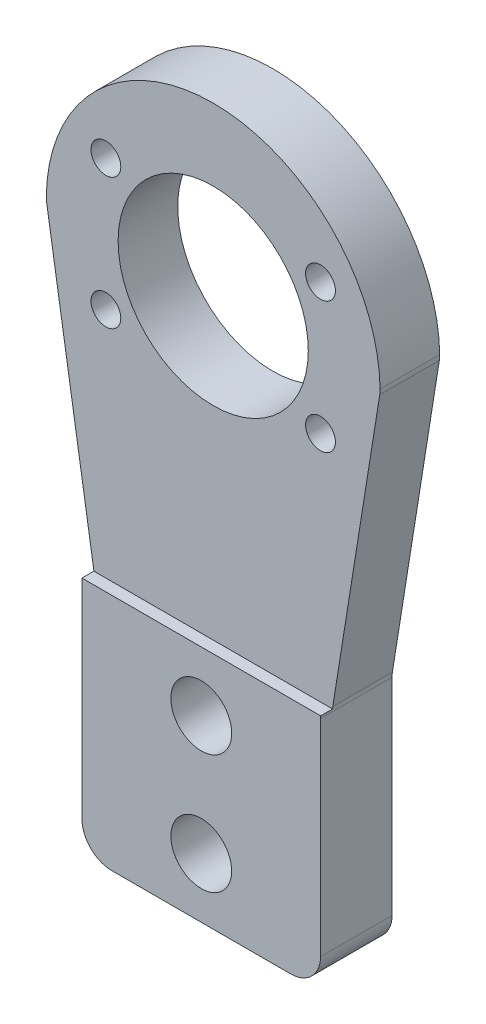
ISO-10303-21;
HEADER;
FILE_DESCRIPTION(('STEP AP214'),'2;1');
FILE_NAME('part.step','',(''),(''),'','','');
FILE_SCHEMA(('AUTOMOTIVE_DESIGN { 1 0 10303 214 1 1 1 1 }'));
ENDSEC;
DATA;
#1=APPLICATION_CONTEXT('core data for automotive mechanical design processes');
#2=APPLICATION_PROTOCOL_DEFINITION('international standard','automotive_design',2000,#1);
#3=PRODUCT_CONTEXT('',#1,'mechanical');
#4=PRODUCT('Part','Part','',(#3));
#5=PRODUCT_RELATED_PRODUCT_CATEGORY('part','',(#4));
#6=PRODUCT_DEFINITION_FORMATION('','',#4);
#7=PRODUCT_DEFINITION_CONTEXT('part definition',#1,'design');
#8=PRODUCT_DEFINITION('design','',#6,#7);
#9=PRODUCT_DEFINITION_SHAPE('','',#8);
#10=(LENGTH_UNIT() NAMED_UNIT(*) SI_UNIT(.MILLI.,.METRE.));
#11=(NAMED_UNIT(*) PLANE_ANGLE_UNIT() SI_UNIT($,.RADIAN.));
#12=(NAMED_UNIT(*) SI_UNIT($,.STERADIAN.) SOLID_ANGLE_UNIT());
#13=UNCERTAINTY_MEASURE_WITH_UNIT(LENGTH_MEASURE(1.E-05),#10,'distance_accuracy_value','');
#14=(GEOMETRIC_REPRESENTATION_CONTEXT(3) GLOBAL_UNCERTAINTY_ASSIGNED_CONTEXT((#13)) GLOBAL_UNIT_ASSIGNED_CONTEXT((#10,
#11,#12)) REPRESENTATION_CONTEXT('',''));
#15=CARTESIAN_POINT('',(0.,0.,0.));
#16=DIRECTION('',(0.,0.,1.));
#17=DIRECTION('',(1.,0.,0.));
#18=AXIS2_PLACEMENT_3D('',#15,#16,#17);
#19=CARTESIAN_POINT('',(0.,30.,6.));
#20=DIRECTION('',(0.,0.,1.));
#21=DIRECTION('',(1.,0.,0.));
#22=AXIS2_PLACEMENT_3D('',#19,#20,#21);
#23=PLANE('',#22);
#24=DIRECTION('',(1.,0.,0.));
#25=VECTOR('',#24,1.);
#26=CARTESIAN_POINT('',(-20.,5.,6.));
#27=LINE('',#26,#25);
#28=CARTESIAN_POINT('',(-10.0079117286826,5.,6.));
#29=VERTEX_POINT('',#28);
#30=CARTESIAN_POINT('',(10.0079117286826,5.,6.));
#31=VERTEX_POINT('',#30);
#32=EDGE_CURVE('E137',#29,#31,#27,.T.);
#33=ORIENTED_EDGE('',*,*,#32,.F.);
#34=CARTESIAN_POINT('',(-12.5,4.8012638735348,6.));
#35=DIRECTION('',(0.,0.,1.));
#36=DIRECTION('',(1.,0.,0.));
#37=AXIS2_PLACEMENT_3D('',#34,#35,#36);
#38=CIRCLE('',#37,2.5);
#39=CARTESIAN_POINT('',(-10.,4.8012638735348,6.));
#40=VERTEX_POINT('',#39);
#41=EDGE_CURVE('E41',#29,#40,#38,.F.);
#42=ORIENTED_EDGE('',*,*,#41,.T.);
#43=DIRECTION('',(0.,-1.,0.));
#44=VECTOR('',#43,1.);
#45=CARTESIAN_POINT('',(-10.,-15.,6.));
#46=LINE('',#45,#44);
#47=CARTESIAN_POINT('',(-10.,-12.5,6.));
#48=VERTEX_POINT('',#47);
#49=EDGE_CURVE('E222',#40,#48,#46,.T.);
#50=ORIENTED_EDGE('',*,*,#49,.T.);
#51=CARTESIAN_POINT('',(-7.5,-12.5,6.));
#52=DIRECTION('',(0.,0.,1.));
#53=DIRECTION('',(1.,0.,0.));
#54=AXIS2_PLACEMENT_3D('',#51,#52,#53);
#55=CIRCLE('',#54,2.5);
#56=CARTESIAN_POINT('',(-7.5,-15.,6.));
#57=VERTEX_POINT('',#56);
#58=EDGE_CURVE('E263',#48,#57,#55,.T.);
#59=ORIENTED_EDGE('',*,*,#58,.T.);
#60=DIRECTION('',(1.,0.,0.));
#61=VECTOR('',#60,1.);
#62=CARTESIAN_POINT('',(10.,-15.,6.));
#63=LINE('',#62,#61);
#64=CARTESIAN_POINT('',(7.5,-15.,6.));
#65=VERTEX_POINT('',#64);
#66=EDGE_CURVE('E224',#57,#65,#63,.T.);
#67=ORIENTED_EDGE('',*,*,#66,.T.);
#68=CARTESIAN_POINT('',(7.5,-12.5,6.));
#69=DIRECTION('',(0.,0.,1.));
#70=DIRECTION('',(1.,0.,0.));
#71=AXIS2_PLACEMENT_3D('',#68,#69,#70);
#72=CIRCLE('',#71,2.5);
#73=CARTESIAN_POINT('',(10.,-12.5,6.));
#74=VERTEX_POINT('',#73);
#75=EDGE_CURVE('E265',#65,#74,#72,.T.);
#76=ORIENTED_EDGE('',*,*,#75,.T.);
#77=DIRECTION('',(0.,1.,0.));
#78=VECTOR('',#77,1.);
#79=CARTESIAN_POINT('',(10.,-15.,6.));
#80=LINE('',#79,#78);
#81=CARTESIAN_POINT('',(10.,4.80126387353479,6.));
#82=VERTEX_POINT('',#81);
#83=EDGE_CURVE('E228',#74,#82,#80,.T.);
#84=ORIENTED_EDGE('',*,*,#83,.T.);
#85=CARTESIAN_POINT('',(12.5,4.8012638735348,6.));
#86=DIRECTION('',(0.,0.,1.));
#87=DIRECTION('',(1.,0.,0.));
#88=AXIS2_PLACEMENT_3D('',#85,#86,#87);
#89=CIRCLE('',#88,2.5);
#90=EDGE_CURVE('E149',#82,#31,#89,.F.);
#91=ORIENTED_EDGE('',*,*,#90,.T.);
#92=EDGE_LOOP('',(#33,#42,#50,#59,#67,#76,#84,#91));
#93=FACE_BOUND('',#92,.T.);
#94=CARTESIAN_POINT('',(0.,0.,6.));
#95=DIRECTION('',(0.,0.,1.));
#96=DIRECTION('',(1.,0.,0.));
#97=AXIS2_PLACEMENT_3D('',#94,#95,#96);
#98=CIRCLE('',#97,2.55);
#99=CARTESIAN_POINT('',(2.55,0.,6.));
#100=VERTEX_POINT('',#99);
#101=EDGE_CURVE('E216',#100,#100,#98,.T.);
#102=ORIENTED_EDGE('',*,*,#101,.F.);
#103=EDGE_LOOP('',(#102));
#104=FACE_BOUND('',#103,.T.);
#105=CARTESIAN_POINT('',(0.,-10.,6.));
#106=DIRECTION('',(0.,0.,1.));
#107=DIRECTION('',(1.,0.,0.));
#108=AXIS2_PLACEMENT_3D('',#105,#106,#107);
#109=CIRCLE('',#108,2.55);
#110=CARTESIAN_POINT('',(2.55,-10.,6.));
#111=VERTEX_POINT('',#110);
#112=EDGE_CURVE('E210',#111,#111,#109,.T.);
#113=ORIENTED_EDGE('',*,*,#112,.F.);
#114=EDGE_LOOP('',(#113));
#115=FACE_BOUND('',#114,.T.);
#116=ADVANCED_FACE('F33',(#93,#104,#115),#23,.T.);
#117=CARTESIAN_POINT('',(0.,30.,0.));
#118=DIRECTION('',(0.,0.,1.));
#119=DIRECTION('',(1.,0.,0.));
#120=AXIS2_PLACEMENT_3D('',#117,#118,#119);
#121=PLANE('',#120);
#122=CARTESIAN_POINT('',(9.,35.5,0.));
#123=DIRECTION('',(0.,0.,1.));
#124=DIRECTION('',(1.,0.,0.));
#125=AXIS2_PLACEMENT_3D('',#122,#123,#124);
#126=CIRCLE('',#125,1.25);
#127=CARTESIAN_POINT('',(10.25,35.5,0.));
#128=VERTEX_POINT('',#127);
#129=EDGE_CURVE('E194',#128,#128,#126,.T.);
#130=ORIENTED_EDGE('',*,*,#129,.T.);
#131=EDGE_LOOP('',(#130));
#132=FACE_BOUND('',#131,.T.);
#133=CARTESIAN_POINT('',(-9.,35.5,0.));
#134=DIRECTION('',(0.,0.,1.));
#135=DIRECTION('',(1.,0.,0.));
#136=AXIS2_PLACEMENT_3D('',#133,#134,#135);
#137=CIRCLE('',#136,1.25);
#138=CARTESIAN_POINT('',(-7.75,35.5,0.));
#139=VERTEX_POINT('',#138);
#140=EDGE_CURVE('E197',#139,#139,#137,.T.);
#141=ORIENTED_EDGE('',*,*,#140,.T.);
#142=EDGE_LOOP('',(#141));
#143=FACE_BOUND('',#142,.T.);
#144=CARTESIAN_POINT('',(9.,24.5,0.));
#145=DIRECTION('',(0.,0.,1.));
#146=DIRECTION('',(1.,0.,0.));
#147=AXIS2_PLACEMENT_3D('',#144,#145,#146);
#148=CIRCLE('',#147,1.25);
#149=CARTESIAN_POINT('',(10.25,24.5,0.));
#150=VERTEX_POINT('',#149);
#151=EDGE_CURVE('E200',#150,#150,#148,.T.);
#152=ORIENTED_EDGE('',*,*,#151,.T.);
#153=EDGE_LOOP('',(#152));
#154=FACE_BOUND('',#153,.T.);
#155=CARTESIAN_POINT('',(-9.,24.5,0.));
#156=DIRECTION('',(0.,0.,1.));
#157=DIRECTION('',(1.,0.,0.));
#158=AXIS2_PLACEMENT_3D('',#155,#156,#157);
#159=CIRCLE('',#158,1.25);
#160=CARTESIAN_POINT('',(-7.75,24.5,0.));
#161=VERTEX_POINT('',#160);
#162=EDGE_CURVE('E203',#161,#161,#159,.T.);
#163=ORIENTED_EDGE('',*,*,#162,.T.);
#164=EDGE_LOOP('',(#163));
#165=FACE_BOUND('',#164,.T.);
#166=CARTESIAN_POINT('',(0.,30.,0.));
#167=DIRECTION('',(0.,0.,1.));
#168=DIRECTION('',(1.,0.,0.));
#169=AXIS2_PLACEMENT_3D('',#166,#167,#168);
#170=CIRCLE('',#169,7.975);
#171=CARTESIAN_POINT('',(7.975,30.,0.));
#172=VERTEX_POINT('',#171);
#173=EDGE_CURVE('E206',#172,#172,#170,.T.);
#174=ORIENTED_EDGE('',*,*,#173,.T.);
#175=EDGE_LOOP('',(#174));
#176=FACE_BOUND('',#175,.T.);
#177=CARTESIAN_POINT('',(0.,0.,0.));
#178=DIRECTION('',(0.,0.,1.));
#179=DIRECTION('',(1.,0.,0.));
#180=AXIS2_PLACEMENT_3D('',#177,#178,#179);
#181=CIRCLE('',#180,2.55);
#182=CARTESIAN_POINT('',(2.55,0.,0.));
#183=VERTEX_POINT('',#182);
#184=EDGE_CURVE('E213',#183,#183,#181,.T.);
#185=ORIENTED_EDGE('',*,*,#184,.T.);
#186=EDGE_LOOP('',(#185));
#187=FACE_BOUND('',#186,.T.);
#188=DIRECTION('',(0.157990501106673,-0.987440631916705,0.));
#189=VECTOR('',#188,1.);
#190=CARTESIAN_POINT('',(-10.,5.,0.));
#191=LINE('',#190,#189);
#192=CARTESIAN_POINT('',(-13.9670479604635,29.7940497528969,0.));
#193=VERTEX_POINT('',#192);
#194=CARTESIAN_POINT('',(-10.0313984202082,5.19624012630148,0.));
#195=VERTEX_POINT('',#194);
#196=EDGE_CURVE('E233',#193,#195,#191,.T.);
#197=ORIENTED_EDGE('',*,*,#196,.F.);
#198=CARTESIAN_POINT('',(-11.4984463806717,30.1890260056635,0.));
#199=DIRECTION('',(0.,0.,1.));
#200=DIRECTION('',(1.,0.,0.));
#201=AXIS2_PLACEMENT_3D('',#198,#199,#200);
#202=CIRCLE('',#201,2.5);
#203=CARTESIAN_POINT('',(-13.9981086373395,30.2301186155904,0.));
#204=VERTEX_POINT('',#203);
#205=EDGE_CURVE('E256',#193,#204,#202,.F.);
#206=ORIENTED_EDGE('',*,*,#205,.T.);
#207=CARTESIAN_POINT('',(0.,30.,0.));
#208=DIRECTION('',(0.,0.,1.));
#209=DIRECTION('',(1.,0.,0.));
#210=AXIS2_PLACEMENT_3D('',#207,#208,#209);
#211=CIRCLE('',#210,14.);
#212=CARTESIAN_POINT('',(13.9981086373395,30.2301186155904,0.));
#213=VERTEX_POINT('',#212);
#214=EDGE_CURVE('E219',#213,#204,#211,.T.);
#215=ORIENTED_EDGE('',*,*,#214,.F.);
#216=CARTESIAN_POINT('',(11.4984463806717,30.1890260056635,0.));
#217=DIRECTION('',(0.,0.,1.));
#218=DIRECTION('',(1.,0.,0.));
#219=AXIS2_PLACEMENT_3D('',#216,#217,#218);
#220=CIRCLE('',#219,2.5);
#221=CARTESIAN_POINT('',(13.9670479604635,29.7940497528969,0.));
#222=VERTEX_POINT('',#221);
#223=EDGE_CURVE('E254',#213,#222,#220,.F.);
#224=ORIENTED_EDGE('',*,*,#223,.T.);
#225=DIRECTION('',(0.157990501106673,0.987440631916705,0.));
#226=VECTOR('',#225,1.);
#227=CARTESIAN_POINT('',(10.,5.,0.));
#228=LINE('',#227,#226);
#229=CARTESIAN_POINT('',(10.0313984202082,5.19624012630148,0.));
#230=VERTEX_POINT('',#229);
#231=EDGE_CURVE('E225',#230,#222,#228,.T.);
#232=ORIENTED_EDGE('',*,*,#231,.F.);
#233=CARTESIAN_POINT('',(12.5,4.8012638735348,0.));
#234=DIRECTION('',(0.,0.,1.));
#235=DIRECTION('',(1.,0.,0.));
#236=AXIS2_PLACEMENT_3D('',#233,#234,#235);
#237=CIRCLE('',#236,2.5);
#238=CARTESIAN_POINT('',(10.,4.80126387353479,0.));
#239=VERTEX_POINT('',#238);
#240=EDGE_CURVE('E284',#230,#239,#237,.T.);
#241=ORIENTED_EDGE('',*,*,#240,.T.);
#242=DIRECTION('',(0.,1.,0.));
#243=VECTOR('',#242,1.);
#244=CARTESIAN_POINT('',(10.,-15.,0.));
#245=LINE('',#244,#243);
#246=CARTESIAN_POINT('',(10.,-12.5,0.));
#247=VERTEX_POINT('',#246);
#248=EDGE_CURVE('E242',#247,#239,#245,.T.);
#249=ORIENTED_EDGE('',*,*,#248,.F.);
#250=CARTESIAN_POINT('',(7.5,-12.5,0.));
#251=DIRECTION('',(0.,0.,1.));
#252=DIRECTION('',(1.,0.,0.));
#253=AXIS2_PLACEMENT_3D('',#250,#251,#252);
#254=CIRCLE('',#253,2.5);
#255=CARTESIAN_POINT('',(7.5,-15.,0.));
#256=VERTEX_POINT('',#255);
#257=EDGE_CURVE('E252',#247,#256,#254,.F.);
#258=ORIENTED_EDGE('',*,*,#257,.T.);
#259=DIRECTION('',(1.,0.,0.));
#260=VECTOR('',#259,1.);
#261=CARTESIAN_POINT('',(10.,-15.,0.));
#262=LINE('',#261,#260);
#263=CARTESIAN_POINT('',(-7.5,-15.,0.));
#264=VERTEX_POINT('',#263);
#265=EDGE_CURVE('E239',#264,#256,#262,.T.);
#266=ORIENTED_EDGE('',*,*,#265,.F.);
#267=CARTESIAN_POINT('',(-7.5,-12.5,0.));
#268=DIRECTION('',(0.,0.,1.));
#269=DIRECTION('',(1.,0.,0.));
#270=AXIS2_PLACEMENT_3D('',#267,#268,#269);
#271=CIRCLE('',#270,2.5);
#272=CARTESIAN_POINT('',(-10.,-12.5,0.));
#273=VERTEX_POINT('',#272);
#274=EDGE_CURVE('E250',#264,#273,#271,.F.);
#275=ORIENTED_EDGE('',*,*,#274,.T.);
#276=DIRECTION('',(0.,-1.,0.));
#277=VECTOR('',#276,1.);
#278=CARTESIAN_POINT('',(-10.,-15.,0.));
#279=LINE('',#278,#277);
#280=CARTESIAN_POINT('',(-10.,4.8012638735348,0.));
#281=VERTEX_POINT('',#280);
#282=EDGE_CURVE('E236',#281,#273,#279,.T.);
#283=ORIENTED_EDGE('',*,*,#282,.F.);
#284=CARTESIAN_POINT('',(-12.5,4.8012638735348,0.));
#285=DIRECTION('',(0.,0.,1.));
#286=DIRECTION('',(1.,0.,0.));
#287=AXIS2_PLACEMENT_3D('',#284,#285,#286);
#288=CIRCLE('',#287,2.5);
#289=EDGE_CURVE('E154',#281,#195,#288,.T.);
#290=ORIENTED_EDGE('',*,*,#289,.T.);
#291=EDGE_LOOP('',(#197,#206,#215,#224,#232,#241,#249,#258,#266,#275,#283,#290));
#292=FACE_BOUND('',#291,.T.);
#293=CARTESIAN_POINT('',(0.,-10.,0.));
#294=DIRECTION('',(0.,0.,1.));
#295=DIRECTION('',(1.,0.,0.));
#296=AXIS2_PLACEMENT_3D('',#293,#294,#295);
#297=CIRCLE('',#296,2.55);
#298=CARTESIAN_POINT('',(2.55,-10.,0.));
#299=VERTEX_POINT('',#298);
#300=EDGE_CURVE('E209',#299,#299,#297,.T.);
#301=ORIENTED_EDGE('',*,*,#300,.T.);
#302=EDGE_LOOP('',(#301));
#303=FACE_BOUND('',#302,.T.);
#304=ADVANCED_FACE('F290',(#132,#143,#154,#165,#176,#187,#292,#303),#121,.F.);
#305=CARTESIAN_POINT('',(0.,30.,6.));
#306=DIRECTION('',(0.,0.,-1.));
#307=DIRECTION('',(-1.,0.,0.));
#308=AXIS2_PLACEMENT_3D('',#305,#306,#307);
#309=CYLINDRICAL_SURFACE('',#308,14.);
#310=DIRECTION('',(0.,0.,-1.));
#311=VECTOR('',#310,1.);
#312=CARTESIAN_POINT('',(-13.9981086373395,30.2301186155904,6.));
#313=LINE('',#312,#311);
#314=CARTESIAN_POINT('',(-13.9981086373395,30.2301186155904,5.));
#315=VERTEX_POINT('',#314);
#316=EDGE_CURVE('E260',#204,#315,#313,.F.);
#317=ORIENTED_EDGE('',*,*,#316,.T.);
#318=CARTESIAN_POINT('',(0.,30.,5.));
#319=DIRECTION('',(0.,0.,-1.));
#320=DIRECTION('',(-1.,0.,0.));
#321=AXIS2_PLACEMENT_3D('',#318,#319,#320);
#322=CIRCLE('',#321,14.);
#323=CARTESIAN_POINT('',(13.9981086373395,30.2301186155904,5.));
#324=VERTEX_POINT('',#323);
#325=EDGE_CURVE('E182',#315,#324,#322,.T.);
#326=ORIENTED_EDGE('',*,*,#325,.T.);
#327=DIRECTION('',(0.,0.,-1.));
#328=VECTOR('',#327,1.);
#329=CARTESIAN_POINT('',(13.9981086373395,30.2301186155904,6.));
#330=LINE('',#329,#328);
#331=EDGE_CURVE('E258',#324,#213,#330,.T.);
#332=ORIENTED_EDGE('',*,*,#331,.T.);
#333=ORIENTED_EDGE('',*,*,#214,.T.);
#334=EDGE_LOOP('',(#317,#326,#332,#333));
#335=FACE_BOUND('',#334,.T.);
#336=ADVANCED_FACE('F309',(#335),#309,.T.);
#337=CARTESIAN_POINT('',(-10.,5.,6.));
#338=DIRECTION('',(0.987440631916705,0.157990501106673,0.));
#339=DIRECTION('',(-0.157990501106673,0.987440631916705,0.));
#340=AXIS2_PLACEMENT_3D('',#337,#338,#339);
#341=PLANE('',#340);
#342=DIRECTION('',(0.,0.,-1.));
#343=VECTOR('',#342,1.);
#344=CARTESIAN_POINT('',(-10.0313984202082,5.19624012630148,6.));
#345=LINE('',#344,#343);
#346=CARTESIAN_POINT('',(-10.0313984202082,5.19624012630148,5.));
#347=VERTEX_POINT('',#346);
#348=EDGE_CURVE('E230',#195,#347,#345,.F.);
#349=ORIENTED_EDGE('',*,*,#348,.T.);
#350=DIRECTION('',(-0.157990501106673,0.987440631916705,0.));
#351=VECTOR('',#350,1.);
#352=CARTESIAN_POINT('',(-10.,5.,5.));
#353=LINE('',#352,#351);
#354=CARTESIAN_POINT('',(-13.9670479604635,29.7940497528969,5.));
#355=VERTEX_POINT('',#354);
#356=EDGE_CURVE('E48',#347,#355,#353,.T.);
#357=ORIENTED_EDGE('',*,*,#356,.T.);
#358=DIRECTION('',(0.,0.,-1.));
#359=VECTOR('',#358,1.);
#360=CARTESIAN_POINT('',(-13.9670479604635,29.7940497528969,6.));
#361=LINE('',#360,#359);
#362=EDGE_CURVE('E248',#355,#193,#361,.T.);
#363=ORIENTED_EDGE('',*,*,#362,.T.);
#364=ORIENTED_EDGE('',*,*,#196,.T.);
#365=EDGE_LOOP('',(#349,#357,#363,#364));
#366=FACE_BOUND('',#365,.T.);
#367=ADVANCED_FACE('F316',(#366),#341,.F.);
#368=CARTESIAN_POINT('',(-10.,-15.,6.));
#369=DIRECTION('',(1.,0.,0.));
#370=DIRECTION('',(0.,0.,-1.));
#371=AXIS2_PLACEMENT_3D('',#368,#369,#370);
#372=PLANE('',#371);
#373=ORIENTED_EDGE('',*,*,#282,.T.);
#374=DIRECTION('',(0.,0.,-1.));
#375=VECTOR('',#374,1.);
#376=CARTESIAN_POINT('',(-10.,-12.5,6.));
#377=LINE('',#376,#375);
#378=EDGE_CURVE('E282',#273,#48,#377,.F.);
#379=ORIENTED_EDGE('',*,*,#378,.T.);
#380=ORIENTED_EDGE('',*,*,#49,.F.);
#381=DIRECTION('',(0.,0.,-1.));
#382=VECTOR('',#381,1.);
#383=CARTESIAN_POINT('',(-10.,4.8012638735348,0.));
#384=LINE('',#383,#382);
#385=EDGE_CURVE('E153',#40,#281,#384,.T.);
#386=ORIENTED_EDGE('',*,*,#385,.T.);
#387=EDGE_LOOP('',(#373,#379,#380,#386));
#388=FACE_BOUND('',#387,.T.);
#389=ADVANCED_FACE('F320',(#388),#372,.F.);
#390=CARTESIAN_POINT('',(10.,-15.,6.));
#391=DIRECTION('',(0.,1.,0.));
#392=DIRECTION('',(-1.,0.,0.));
#393=AXIS2_PLACEMENT_3D('',#390,#391,#392);
#394=PLANE('',#393);
#395=ORIENTED_EDGE('',*,*,#265,.T.);
#396=DIRECTION('',(0.,0.,-1.));
#397=VECTOR('',#396,1.);
#398=CARTESIAN_POINT('',(7.5,-15.,6.));
#399=LINE('',#398,#397);
#400=EDGE_CURVE('E279',#256,#65,#399,.F.);
#401=ORIENTED_EDGE('',*,*,#400,.T.);
#402=ORIENTED_EDGE('',*,*,#66,.F.);
#403=DIRECTION('',(0.,0.,-1.));
#404=VECTOR('',#403,1.);
#405=CARTESIAN_POINT('',(-7.5,-15.,6.));
#406=LINE('',#405,#404);
#407=EDGE_CURVE('E276',#57,#264,#406,.T.);
#408=ORIENTED_EDGE('',*,*,#407,.T.);
#409=EDGE_LOOP('',(#395,#401,#402,#408));
#410=FACE_BOUND('',#409,.T.);
#411=ADVANCED_FACE('F329',(#410),#394,.F.);
#412=CARTESIAN_POINT('',(10.,-15.,6.));
#413=DIRECTION('',(-1.,0.,0.));
#414=DIRECTION('',(0.,0.,1.));
#415=AXIS2_PLACEMENT_3D('',#412,#413,#414);
#416=PLANE('',#415);
#417=ORIENTED_EDGE('',*,*,#248,.T.);
#418=DIRECTION('',(0.,0.,-1.));
#419=VECTOR('',#418,1.);
#420=CARTESIAN_POINT('',(10.,4.8012638735348,6.));
#421=LINE('',#420,#419);
#422=EDGE_CURVE('E56',#239,#82,#421,.F.);
#423=ORIENTED_EDGE('',*,*,#422,.T.);
#424=ORIENTED_EDGE('',*,*,#83,.F.);
#425=DIRECTION('',(0.,0.,-1.));
#426=VECTOR('',#425,1.);
#427=CARTESIAN_POINT('',(10.,-12.5,6.));
#428=LINE('',#427,#426);
#429=EDGE_CURVE('E272',#74,#247,#428,.T.);
#430=ORIENTED_EDGE('',*,*,#429,.T.);
#431=EDGE_LOOP('',(#417,#423,#424,#430));
#432=FACE_BOUND('',#431,.T.);
#433=ADVANCED_FACE('F294',(#432),#416,.F.);
#434=CARTESIAN_POINT('',(10.,5.,6.));
#435=DIRECTION('',(-0.987440631916705,0.157990501106673,0.));
#436=DIRECTION('',(-0.157990501106673,-0.987440631916705,0.));
#437=AXIS2_PLACEMENT_3D('',#434,#435,#436);
#438=PLANE('',#437);
#439=DIRECTION('',(0.,0.,-1.));
#440=VECTOR('',#439,1.);
#441=CARTESIAN_POINT('',(13.9670479604635,29.7940497528969,6.));
#442=LINE('',#441,#440);
#443=CARTESIAN_POINT('',(13.9670479604635,29.7940497528969,5.));
#444=VERTEX_POINT('',#443);
#445=EDGE_CURVE('E269',#222,#444,#442,.F.);
#446=ORIENTED_EDGE('',*,*,#445,.T.);
#447=DIRECTION('',(-0.157990501106673,-0.987440631916705,0.));
#448=VECTOR('',#447,1.);
#449=CARTESIAN_POINT('',(10.,5.,5.));
#450=LINE('',#449,#448);
#451=CARTESIAN_POINT('',(10.0313984202082,5.19624012630148,5.));
#452=VERTEX_POINT('',#451);
#453=EDGE_CURVE('E187',#444,#452,#450,.T.);
#454=ORIENTED_EDGE('',*,*,#453,.T.);
#455=DIRECTION('',(0.,0.,-1.));
#456=VECTOR('',#455,1.);
#457=CARTESIAN_POINT('',(10.0313984202082,5.19624012630148,0.));
#458=LINE('',#457,#456);
#459=EDGE_CURVE('E267',#452,#230,#458,.T.);
#460=ORIENTED_EDGE('',*,*,#459,.T.);
#461=ORIENTED_EDGE('',*,*,#231,.T.);
#462=EDGE_LOOP('',(#446,#454,#460,#461));
#463=FACE_BOUND('',#462,.T.);
#464=ADVANCED_FACE('F300',(#463),#438,.F.);
#465=CARTESIAN_POINT('',(0.,0.,6.));
#466=DIRECTION('',(0.,0.,-1.));
#467=DIRECTION('',(-1.,0.,0.));
#468=AXIS2_PLACEMENT_3D('',#465,#466,#467);
#469=CYLINDRICAL_SURFACE('',#468,2.55);
#470=ORIENTED_EDGE('',*,*,#101,.T.);
#471=EDGE_LOOP('',(#470));
#472=FACE_BOUND('',#471,.T.);
#473=ORIENTED_EDGE('',*,*,#184,.F.);
#474=EDGE_LOOP('',(#473));
#475=FACE_BOUND('',#474,.T.);
#476=ADVANCED_FACE('F349',(#472,#475),#469,.F.);
#477=CARTESIAN_POINT('',(0.,-10.,6.));
#478=DIRECTION('',(0.,0.,-1.));
#479=DIRECTION('',(-1.,0.,0.));
#480=AXIS2_PLACEMENT_3D('',#477,#478,#479);
#481=CYLINDRICAL_SURFACE('',#480,2.55);
#482=ORIENTED_EDGE('',*,*,#112,.T.);
#483=EDGE_LOOP('',(#482));
#484=FACE_BOUND('',#483,.T.);
#485=ORIENTED_EDGE('',*,*,#300,.F.);
#486=EDGE_LOOP('',(#485));
#487=FACE_BOUND('',#486,.T.);
#488=ADVANCED_FACE('F366',(#484,#487),#481,.F.);
#489=CARTESIAN_POINT('',(-11.4984463806717,30.1890260056635,6.));
#490=DIRECTION('',(0.,0.,-1.));
#491=DIRECTION('',(-1.,0.,0.));
#492=AXIS2_PLACEMENT_3D('',#489,#490,#491);
#493=CYLINDRICAL_SURFACE('',#492,2.5);
#494=CARTESIAN_POINT('',(-11.4984463806717,30.1890260056635,5.));
#495=DIRECTION('',(0.,0.,-1.));
#496=DIRECTION('',(-1.,0.,0.));
#497=AXIS2_PLACEMENT_3D('',#494,#495,#496);
#498=CIRCLE('',#497,2.5);
#499=EDGE_CURVE('E180',#315,#355,#498,.F.);
#500=ORIENTED_EDGE('',*,*,#499,.F.);
#501=ORIENTED_EDGE('',*,*,#316,.F.);
#502=ORIENTED_EDGE('',*,*,#205,.F.);
#503=ORIENTED_EDGE('',*,*,#362,.F.);
#504=EDGE_LOOP('',(#500,#501,#502,#503));
#505=FACE_BOUND('',#504,.T.);
#506=ADVANCED_FACE('F313',(#505),#493,.T.);
#507=CARTESIAN_POINT('',(11.4984463806717,30.1890260056635,6.));
#508=DIRECTION('',(0.,0.,-1.));
#509=DIRECTION('',(-1.,0.,0.));
#510=AXIS2_PLACEMENT_3D('',#507,#508,#509);
#511=CYLINDRICAL_SURFACE('',#510,2.5);
#512=CARTESIAN_POINT('',(11.4984463806717,30.1890260056635,5.));
#513=DIRECTION('',(0.,0.,-1.));
#514=DIRECTION('',(-1.,0.,0.));
#515=AXIS2_PLACEMENT_3D('',#512,#513,#514);
#516=CIRCLE('',#515,2.5);
#517=EDGE_CURVE('E185',#444,#324,#516,.F.);
#518=ORIENTED_EDGE('',*,*,#517,.F.);
#519=ORIENTED_EDGE('',*,*,#445,.F.);
#520=ORIENTED_EDGE('',*,*,#223,.F.);
#521=ORIENTED_EDGE('',*,*,#331,.F.);
#522=EDGE_LOOP('',(#518,#519,#520,#521));
#523=FACE_BOUND('',#522,.T.);
#524=ADVANCED_FACE('F304',(#523),#511,.T.);
#525=CARTESIAN_POINT('',(12.5,4.8012638735348,6.));
#526=DIRECTION('',(0.,0.,1.));
#527=DIRECTION('',(1.,0.,0.));
#528=AXIS2_PLACEMENT_3D('',#525,#526,#527);
#529=CYLINDRICAL_SURFACE('',#528,2.5);
#530=CARTESIAN_POINT('',(12.5,4.8012638735348,5.));
#531=DIRECTION('',(0.,0.,-1.));
#532=DIRECTION('',(-1.,0.,0.));
#533=AXIS2_PLACEMENT_3D('',#530,#531,#532);
#534=CIRCLE('',#533,2.5);
#535=CARTESIAN_POINT('',(10.0079117286826,5.,5.));
#536=VERTEX_POINT('',#535);
#537=EDGE_CURVE('E190',#452,#536,#534,.F.);
#538=ORIENTED_EDGE('',*,*,#537,.T.);
#539=DIRECTION('',(0.,0.,1.));
#540=VECTOR('',#539,1.);
#541=CARTESIAN_POINT('',(10.0079117286826,5.,6.));
#542=LINE('',#541,#540);
#543=EDGE_CURVE('E192',#536,#31,#542,.T.);
#544=ORIENTED_EDGE('',*,*,#543,.T.);
#545=ORIENTED_EDGE('',*,*,#90,.F.);
#546=ORIENTED_EDGE('',*,*,#422,.F.);
#547=ORIENTED_EDGE('',*,*,#240,.F.);
#548=ORIENTED_EDGE('',*,*,#459,.F.);
#549=EDGE_LOOP('',(#538,#544,#545,#546,#547,#548));
#550=FACE_BOUND('',#549,.T.);
#551=ADVANCED_FACE('F296',(#550),#529,.F.);
#552=CARTESIAN_POINT('',(7.5,-12.5,6.));
#553=DIRECTION('',(0.,0.,-1.));
#554=DIRECTION('',(-1.,0.,0.));
#555=AXIS2_PLACEMENT_3D('',#552,#553,#554);
#556=CYLINDRICAL_SURFACE('',#555,2.5);
#557=ORIENTED_EDGE('',*,*,#75,.F.);
#558=ORIENTED_EDGE('',*,*,#400,.F.);
#559=ORIENTED_EDGE('',*,*,#257,.F.);
#560=ORIENTED_EDGE('',*,*,#429,.F.);
#561=EDGE_LOOP('',(#557,#558,#559,#560));
#562=FACE_BOUND('',#561,.T.);
#563=ADVANCED_FACE('F333',(#562),#556,.T.);
#564=CARTESIAN_POINT('',(-7.5,-12.5,6.));
#565=DIRECTION('',(0.,0.,-1.));
#566=DIRECTION('',(-1.,0.,0.));
#567=AXIS2_PLACEMENT_3D('',#564,#565,#566);
#568=CYLINDRICAL_SURFACE('',#567,2.5);
#569=ORIENTED_EDGE('',*,*,#58,.F.);
#570=ORIENTED_EDGE('',*,*,#378,.F.);
#571=ORIENTED_EDGE('',*,*,#274,.F.);
#572=ORIENTED_EDGE('',*,*,#407,.F.);
#573=EDGE_LOOP('',(#569,#570,#571,#572));
#574=FACE_BOUND('',#573,.T.);
#575=ADVANCED_FACE('F326',(#574),#568,.T.);
#576=CARTESIAN_POINT('',(-12.5,4.8012638735348,6.));
#577=DIRECTION('',(0.,0.,1.));
#578=DIRECTION('',(1.,0.,0.));
#579=AXIS2_PLACEMENT_3D('',#576,#577,#578);
#580=CYLINDRICAL_SURFACE('',#579,2.5);
#581=ORIENTED_EDGE('',*,*,#41,.F.);
#582=DIRECTION('',(0.,0.,1.));
#583=VECTOR('',#582,1.);
#584=CARTESIAN_POINT('',(-10.0079117286826,5.,6.));
#585=LINE('',#584,#583);
#586=CARTESIAN_POINT('',(-10.0079117286826,5.,5.));
#587=VERTEX_POINT('',#586);
#588=EDGE_CURVE('E11',#29,#587,#585,.F.);
#589=ORIENTED_EDGE('',*,*,#588,.T.);
#590=CARTESIAN_POINT('',(-12.5,4.8012638735348,5.));
#591=DIRECTION('',(0.,0.,-1.));
#592=DIRECTION('',(-1.,0.,0.));
#593=AXIS2_PLACEMENT_3D('',#590,#591,#592);
#594=CIRCLE('',#593,2.5);
#595=EDGE_CURVE('E177',#587,#347,#594,.F.);
#596=ORIENTED_EDGE('',*,*,#595,.T.);
#597=ORIENTED_EDGE('',*,*,#348,.F.);
#598=ORIENTED_EDGE('',*,*,#289,.F.);
#599=ORIENTED_EDGE('',*,*,#385,.F.);
#600=EDGE_LOOP('',(#581,#589,#596,#597,#598,#599));
#601=FACE_BOUND('',#600,.T.);
#602=ADVANCED_FACE('F35',(#601),#580,.F.);
#603=CARTESIAN_POINT('',(0.,30.,0.));
#604=DIRECTION('',(0.,0.,1.));
#605=DIRECTION('',(1.,0.,0.));
#606=AXIS2_PLACEMENT_3D('',#603,#604,#605);
#607=CYLINDRICAL_SURFACE('',#606,7.975);
#608=CARTESIAN_POINT('',(0.,30.,5.));
#609=DIRECTION('',(0.,0.,-1.));
#610=DIRECTION('',(-1.,0.,0.));
#611=AXIS2_PLACEMENT_3D('',#608,#609,#610);
#612=CIRCLE('',#611,7.975);
#613=CARTESIAN_POINT('',(-7.975,30.,5.));
#614=VERTEX_POINT('',#613);
#615=EDGE_CURVE('E174',#614,#614,#612,.F.);
#616=ORIENTED_EDGE('',*,*,#615,.T.);
#617=EDGE_LOOP('',(#616));
#618=FACE_BOUND('',#617,.T.);
#619=ORIENTED_EDGE('',*,*,#173,.F.);
#620=EDGE_LOOP('',(#619));
#621=FACE_BOUND('',#620,.T.);
#622=ADVANCED_FACE('F387',(#618,#621),#607,.F.);
#623=CARTESIAN_POINT('',(-9.,24.5,0.));
#624=DIRECTION('',(0.,0.,1.));
#625=DIRECTION('',(1.,0.,0.));
#626=AXIS2_PLACEMENT_3D('',#623,#624,#625);
#627=CYLINDRICAL_SURFACE('',#626,1.25);
#628=CARTESIAN_POINT('',(-9.,24.5,5.));
#629=DIRECTION('',(0.,0.,-1.));
#630=DIRECTION('',(-1.,0.,0.));
#631=AXIS2_PLACEMENT_3D('',#628,#629,#630);
#632=CIRCLE('',#631,1.25);
#633=CARTESIAN_POINT('',(-10.25,24.5,5.));
#634=VERTEX_POINT('',#633);
#635=EDGE_CURVE('E171',#634,#634,#632,.F.);
#636=ORIENTED_EDGE('',*,*,#635,.T.);
#637=EDGE_LOOP('',(#636));
#638=FACE_BOUND('',#637,.T.);
#639=ORIENTED_EDGE('',*,*,#162,.F.);
#640=EDGE_LOOP('',(#639));
#641=FACE_BOUND('',#640,.T.);
#642=ADVANCED_FACE('F396',(#638,#641),#627,.F.);
#643=CARTESIAN_POINT('',(9.,24.5,0.));
#644=DIRECTION('',(0.,0.,1.));
#645=DIRECTION('',(1.,0.,0.));
#646=AXIS2_PLACEMENT_3D('',#643,#644,#645);
#647=CYLINDRICAL_SURFACE('',#646,1.25);
#648=CARTESIAN_POINT('',(9.,24.5,5.));
#649=DIRECTION('',(0.,0.,-1.));
#650=DIRECTION('',(-1.,0.,0.));
#651=AXIS2_PLACEMENT_3D('',#648,#649,#650);
#652=CIRCLE('',#651,1.25);
#653=CARTESIAN_POINT('',(7.75,24.5,5.));
#654=VERTEX_POINT('',#653);
#655=EDGE_CURVE('E164',#654,#654,#652,.F.);
#656=ORIENTED_EDGE('',*,*,#655,.T.);
#657=EDGE_LOOP('',(#656));
#658=FACE_BOUND('',#657,.T.);
#659=ORIENTED_EDGE('',*,*,#151,.F.);
#660=EDGE_LOOP('',(#659));
#661=FACE_BOUND('',#660,.T.);
#662=ADVANCED_FACE('F406',(#658,#661),#647,.F.);
#663=CARTESIAN_POINT('',(-9.,35.5,0.));
#664=DIRECTION('',(0.,0.,1.));
#665=DIRECTION('',(1.,0.,0.));
#666=AXIS2_PLACEMENT_3D('',#663,#664,#665);
#667=CYLINDRICAL_SURFACE('',#666,1.25);
#668=CARTESIAN_POINT('',(-9.,35.5,5.));
#669=DIRECTION('',(0.,0.,-1.));
#670=DIRECTION('',(-1.,0.,0.));
#671=AXIS2_PLACEMENT_3D('',#668,#669,#670);
#672=CIRCLE('',#671,1.25);
#673=CARTESIAN_POINT('',(-10.25,35.5,5.));
#674=VERTEX_POINT('',#673);
#675=EDGE_CURVE('E160',#674,#674,#672,.F.);
#676=ORIENTED_EDGE('',*,*,#675,.T.);
#677=EDGE_LOOP('',(#676));
#678=FACE_BOUND('',#677,.T.);
#679=ORIENTED_EDGE('',*,*,#140,.F.);
#680=EDGE_LOOP('',(#679));
#681=FACE_BOUND('',#680,.T.);
#682=ADVANCED_FACE('F416',(#678,#681),#667,.F.);
#683=CARTESIAN_POINT('',(9.,35.5,0.));
#684=DIRECTION('',(0.,0.,1.));
#685=DIRECTION('',(1.,0.,0.));
#686=AXIS2_PLACEMENT_3D('',#683,#684,#685);
#687=CYLINDRICAL_SURFACE('',#686,1.25);
#688=CARTESIAN_POINT('',(9.,35.5,5.));
#689=DIRECTION('',(0.,0.,-1.));
#690=DIRECTION('',(-1.,0.,0.));
#691=AXIS2_PLACEMENT_3D('',#688,#689,#690);
#692=CIRCLE('',#691,1.25);
#693=CARTESIAN_POINT('',(7.75,35.5,5.));
#694=VERTEX_POINT('',#693);
#695=EDGE_CURVE('E158',#694,#694,#692,.F.);
#696=ORIENTED_EDGE('',*,*,#695,.T.);
#697=EDGE_LOOP('',(#696));
#698=FACE_BOUND('',#697,.T.);
#699=ORIENTED_EDGE('',*,*,#129,.F.);
#700=EDGE_LOOP('',(#699));
#701=FACE_BOUND('',#700,.T.);
#702=ADVANCED_FACE('F426',(#698,#701),#687,.F.);
#703=CARTESIAN_POINT('',(-20.,5.,5.));
#704=DIRECTION('',(0.,-1.,0.));
#705=DIRECTION('',(0.,0.,-1.));
#706=AXIS2_PLACEMENT_3D('',#703,#704,#705);
#707=PLANE('',#706);
#708=DIRECTION('',(1.,0.,0.));
#709=VECTOR('',#708,1.);
#710=CARTESIAN_POINT('',(-20.,5.,5.));
#711=LINE('',#710,#709);
#712=EDGE_CURVE('E140',#587,#536,#711,.T.);
#713=ORIENTED_EDGE('',*,*,#712,.F.);
#714=ORIENTED_EDGE('',*,*,#588,.F.);
#715=ORIENTED_EDGE('',*,*,#32,.T.);
#716=ORIENTED_EDGE('',*,*,#543,.F.);
#717=EDGE_LOOP('',(#713,#714,#715,#716));
#718=FACE_BOUND('',#717,.T.);
#719=ADVANCED_FACE('F136',(#718),#707,.F.);
#720=CARTESIAN_POINT('',(0.,0.,5.));
#721=DIRECTION('',(0.,0.,-1.));
#722=DIRECTION('',(-1.,0.,0.));
#723=AXIS2_PLACEMENT_3D('',#720,#721,#722);
#724=PLANE('',#723);
#725=ORIENTED_EDGE('',*,*,#615,.F.);
#726=EDGE_LOOP('',(#725));
#727=FACE_BOUND('',#726,.T.);
#728=ORIENTED_EDGE('',*,*,#655,.F.);
#729=EDGE_LOOP('',(#728));
#730=FACE_BOUND('',#729,.T.);
#731=ORIENTED_EDGE('',*,*,#695,.F.);
#732=EDGE_LOOP('',(#731));
#733=FACE_BOUND('',#732,.T.);
#734=ORIENTED_EDGE('',*,*,#675,.F.);
#735=EDGE_LOOP('',(#734));
#736=FACE_BOUND('',#735,.T.);
#737=ORIENTED_EDGE('',*,*,#635,.F.);
#738=EDGE_LOOP('',(#737));
#739=FACE_BOUND('',#738,.T.);
#740=ORIENTED_EDGE('',*,*,#453,.F.);
#741=ORIENTED_EDGE('',*,*,#517,.T.);
#742=ORIENTED_EDGE('',*,*,#325,.F.);
#743=ORIENTED_EDGE('',*,*,#499,.T.);
#744=ORIENTED_EDGE('',*,*,#356,.F.);
#745=ORIENTED_EDGE('',*,*,#595,.F.);
#746=ORIENTED_EDGE('',*,*,#712,.T.);
#747=ORIENTED_EDGE('',*,*,#537,.F.);
#748=EDGE_LOOP('',(#740,#741,#742,#743,#744,#745,#746,#747));
#749=FACE_BOUND('',#748,.T.);
#750=ADVANCED_FACE('F297',(#727,#730,#733,#736,#739,#749),#724,.F.);
#751=CLOSED_SHELL('',(#116,#304,#336,#367,#389,#411,#433,#464,#476,#488,#506,#524,#551,#563,
#575,#602,#622,#642,#662,#682,#702,#719,#750));
#752=MANIFOLD_SOLID_BREP('B2',#751);
#753=ADVANCED_BREP_SHAPE_REPRESENTATION('',(#18,#752),#14);
#754=SHAPE_DEFINITION_REPRESENTATION(#9,#753);
ENDSEC;
END-ISO-10303-21;
